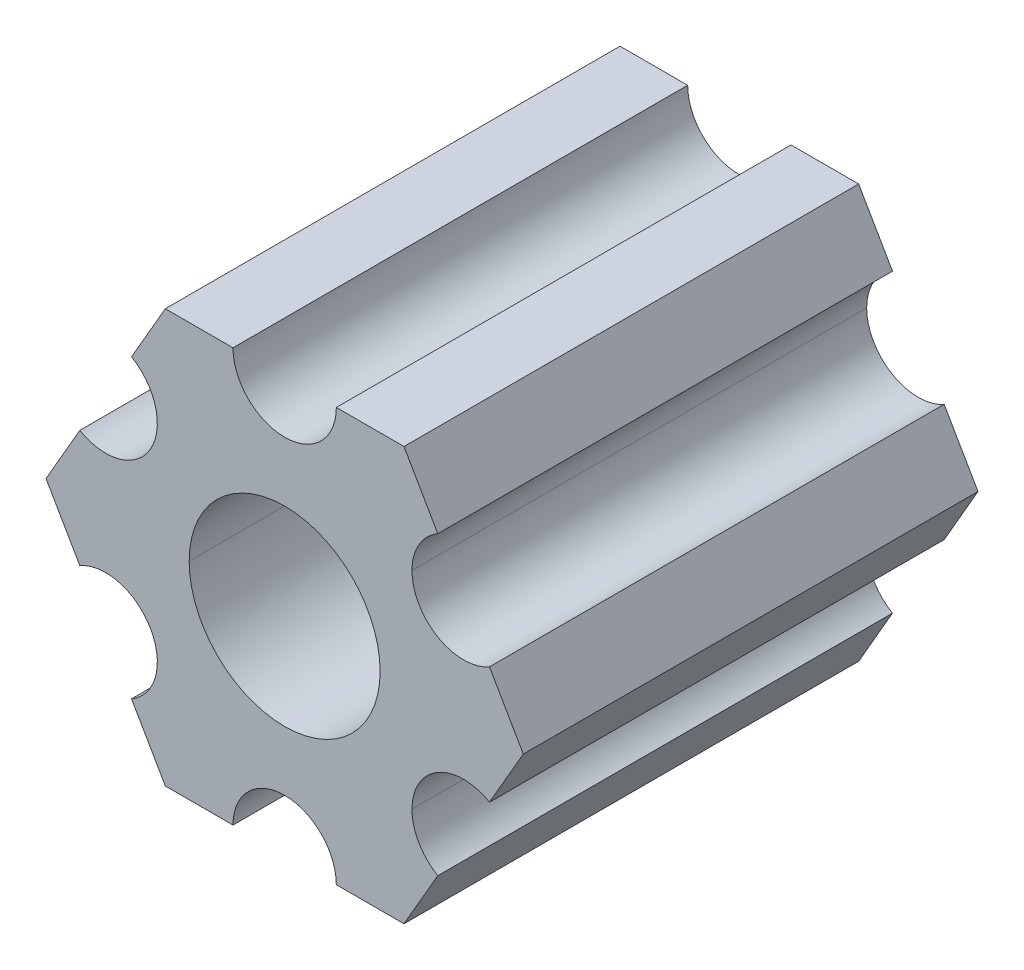
ISO-10303-21;
HEADER;
FILE_DESCRIPTION(('STEP AP214'),'2;1');
FILE_NAME('part.step','',(''),(''),'','','');
FILE_SCHEMA(('AUTOMOTIVE_DESIGN { 1 0 10303 214 1 1 1 1 }'));
ENDSEC;
DATA;
#1=APPLICATION_CONTEXT('core data for automotive mechanical design processes');
#2=APPLICATION_PROTOCOL_DEFINITION('international standard','automotive_design',2000,#1);
#3=PRODUCT_CONTEXT('',#1,'mechanical');
#4=PRODUCT('Part','Part','',(#3));
#5=PRODUCT_RELATED_PRODUCT_CATEGORY('part','',(#4));
#6=PRODUCT_DEFINITION_FORMATION('','',#4);
#7=PRODUCT_DEFINITION_CONTEXT('part definition',#1,'design');
#8=PRODUCT_DEFINITION('design','',#6,#7);
#9=PRODUCT_DEFINITION_SHAPE('','',#8);
#10=(LENGTH_UNIT() NAMED_UNIT(*) SI_UNIT(.MILLI.,.METRE.));
#11=(NAMED_UNIT(*) PLANE_ANGLE_UNIT() SI_UNIT($,.RADIAN.));
#12=(NAMED_UNIT(*) SI_UNIT($,.STERADIAN.) SOLID_ANGLE_UNIT());
#13=UNCERTAINTY_MEASURE_WITH_UNIT(LENGTH_MEASURE(1.E-05),#10,'distance_accuracy_value','');
#14=(GEOMETRIC_REPRESENTATION_CONTEXT(3) GLOBAL_UNCERTAINTY_ASSIGNED_CONTEXT((#13)) GLOBAL_UNIT_ASSIGNED_CONTEXT((#10,
#11,#12)) REPRESENTATION_CONTEXT('',''));
#15=CARTESIAN_POINT('',(0.,0.,0.));
#16=DIRECTION('',(0.,0.,1.));
#17=DIRECTION('',(1.,0.,0.));
#18=AXIS2_PLACEMENT_3D('',#15,#16,#17);
#19=CARTESIAN_POINT('',(0.,0.,304.8));
#20=DIRECTION('',(0.,0.,-1.));
#21=DIRECTION('',(-1.,0.,0.));
#22=AXIS2_PLACEMENT_3D('',#19,#20,#21);
#23=CYLINDRICAL_SURFACE('',#22,2.9337);
#24=DIRECTION('',(0.,0.,-1.));
#25=VECTOR('',#24,1.);
#26=CARTESIAN_POINT('',(2.9337,0.,304.8));
#27=LINE('',#26,#25);
#28=CARTESIAN_POINT('',(2.9337,0.,304.8));
#29=VERTEX_POINT('',#28);
#30=CARTESIAN_POINT('',(2.9337,0.,290.83));
#31=VERTEX_POINT('',#30);
#32=EDGE_CURVE('E220',#29,#31,#27,.T.);
#33=ORIENTED_EDGE('',*,*,#32,.T.);
#34=CARTESIAN_POINT('',(0.,0.,290.83));
#35=DIRECTION('',(0.,0.,1.));
#36=DIRECTION('',(1.,0.,0.));
#37=AXIS2_PLACEMENT_3D('',#34,#35,#36);
#38=CIRCLE('',#37,2.9337);
#39=CARTESIAN_POINT('',(-2.9337,0.,290.83));
#40=VERTEX_POINT('',#39);
#41=EDGE_CURVE('E67',#31,#40,#38,.F.);
#42=ORIENTED_EDGE('',*,*,#41,.T.);
#43=DIRECTION('',(0.,0.,-1.));
#44=VECTOR('',#43,1.);
#45=CARTESIAN_POINT('',(-2.9337,0.,304.8));
#46=LINE('',#45,#44);
#47=CARTESIAN_POINT('',(-2.9337,0.,304.8));
#48=VERTEX_POINT('',#47);
#49=EDGE_CURVE('E218',#48,#40,#46,.T.);
#50=ORIENTED_EDGE('',*,*,#49,.F.);
#51=CARTESIAN_POINT('',(0.,0.,304.8));
#52=DIRECTION('',(0.,0.,1.));
#53=DIRECTION('',(1.,0.,0.));
#54=AXIS2_PLACEMENT_3D('',#51,#52,#53);
#55=CIRCLE('',#54,2.9337);
#56=EDGE_CURVE('E53',#48,#29,#55,.T.);
#57=ORIENTED_EDGE('',*,*,#56,.T.);
#58=EDGE_LOOP('',(#33,#42,#50,#57));
#59=FACE_BOUND('',#58,.T.);
#60=ADVANCED_FACE('F46',(#59),#23,.F.);
#61=CARTESIAN_POINT('',(5.49926150638082,-3.17499966684067,304.8));
#62=DIRECTION('',(0.,0.,-1.));
#63=DIRECTION('',(-1.,0.,0.));
#64=AXIS2_PLACEMENT_3D('',#61,#62,#63);
#65=CYLINDRICAL_SURFACE('',#64,1.5875);
#66=DIRECTION('',(0.,0.,-1.));
#67=VECTOR('',#66,1.);
#68=CARTESIAN_POINT('',(3.91176150638082,-3.17499966684067,304.8));
#69=LINE('',#68,#67);
#70=CARTESIAN_POINT('',(3.91176150638082,-3.17499966684067,304.8));
#71=VERTEX_POINT('',#70);
#72=CARTESIAN_POINT('',(3.91176150638082,-3.17499966684067,290.83));
#73=VERTEX_POINT('',#72);
#74=EDGE_CURVE('E246',#71,#73,#69,.T.);
#75=ORIENTED_EDGE('',*,*,#74,.T.);
#76=CARTESIAN_POINT('',(5.49926150638082,-3.17499966684067,290.83));
#77=DIRECTION('',(0.,0.,1.));
#78=DIRECTION('',(1.,0.,0.));
#79=AXIS2_PLACEMENT_3D('',#76,#77,#78);
#80=CIRCLE('',#79,1.5875);
#81=CARTESIAN_POINT('',(6.29301142309098,-1.80018429024546,290.83));
#82=VERTEX_POINT('',#81);
#83=EDGE_CURVE('E60',#73,#82,#80,.F.);
#84=ORIENTED_EDGE('',*,*,#83,.T.);
#85=DIRECTION('',(0.,0.,-1.));
#86=VECTOR('',#85,1.);
#87=CARTESIAN_POINT('',(6.29301142309098,-1.80018429024546,304.8));
#88=LINE('',#87,#86);
#89=CARTESIAN_POINT('',(6.29301142309098,-1.80018429024546,304.8));
#90=VERTEX_POINT('',#89);
#91=EDGE_CURVE('E344',#90,#82,#88,.T.);
#92=ORIENTED_EDGE('',*,*,#91,.F.);
#93=CARTESIAN_POINT('',(5.49926150638082,-3.17499966684067,304.8));
#94=DIRECTION('',(0.,0.,-1.));
#95=DIRECTION('',(1.,0.,0.));
#96=AXIS2_PLACEMENT_3D('',#93,#94,#95);
#97=CIRCLE('',#96,1.5875);
#98=EDGE_CURVE('E297',#71,#90,#97,.T.);
#99=ORIENTED_EDGE('',*,*,#98,.F.);
#100=EDGE_LOOP('',(#75,#84,#92,#99));
#101=FACE_BOUND('',#100,.T.);
#102=ADVANCED_FACE('F481',(#101),#65,.F.);
#103=CARTESIAN_POINT('',(5.49926112168156,3.17500033315934,304.8));
#104=DIRECTION('',(0.,0.,-1.));
#105=DIRECTION('',(-1.,0.,0.));
#106=AXIS2_PLACEMENT_3D('',#103,#104,#105);
#107=CYLINDRICAL_SURFACE('',#106,1.5875);
#108=DIRECTION('',(0.,0.,-1.));
#109=VECTOR('',#108,1.);
#110=CARTESIAN_POINT('',(3.91176112168156,3.17500033315934,304.8));
#111=LINE('',#110,#109);
#112=CARTESIAN_POINT('',(3.91176112168156,3.17500033315934,304.8));
#113=VERTEX_POINT('',#112);
#114=CARTESIAN_POINT('',(3.91176112168156,3.17500033315934,290.83));
#115=VERTEX_POINT('',#114);
#116=EDGE_CURVE('E243',#113,#115,#111,.T.);
#117=ORIENTED_EDGE('',*,*,#116,.T.);
#118=CARTESIAN_POINT('',(5.49926112168156,3.17500033315934,290.83));
#119=DIRECTION('',(0.,0.,1.));
#120=DIRECTION('',(1.,0.,0.));
#121=AXIS2_PLACEMENT_3D('',#118,#119,#120);
#122=CIRCLE('',#121,1.5875);
#123=CARTESIAN_POINT('',(4.70551103839172,4.54981561357972,290.83));
#124=VERTEX_POINT('',#123);
#125=EDGE_CURVE('E425',#115,#124,#122,.F.);
#126=ORIENTED_EDGE('',*,*,#125,.T.);
#127=DIRECTION('',(0.,0.,-1.));
#128=VECTOR('',#127,1.);
#129=CARTESIAN_POINT('',(4.70551103839172,4.54981561357972,304.8));
#130=LINE('',#129,#128);
#131=CARTESIAN_POINT('',(4.70551103839172,4.54981561357972,304.8));
#132=VERTEX_POINT('',#131);
#133=EDGE_CURVE('E251',#132,#124,#130,.T.);
#134=ORIENTED_EDGE('',*,*,#133,.F.);
#135=CARTESIAN_POINT('',(5.49926112168156,3.17500033315934,304.8));
#136=DIRECTION('',(0.,0.,-1.));
#137=DIRECTION('',(1.,0.,0.));
#138=AXIS2_PLACEMENT_3D('',#135,#136,#137);
#139=CIRCLE('',#138,1.5875);
#140=EDGE_CURVE('E292',#113,#132,#139,.T.);
#141=ORIENTED_EDGE('',*,*,#140,.F.);
#142=EDGE_LOOP('',(#117,#126,#134,#141));
#143=FACE_BOUND('',#142,.T.);
#144=ADVANCED_FACE('F423',(#143),#107,.F.);
#145=CARTESIAN_POINT('',(5.49926112168156,3.17500033315934,304.8));
#146=DIRECTION('',(0.,0.,1.));
#147=DIRECTION('',(1.,0.,0.));
#148=AXIS2_PLACEMENT_3D('',#145,#146,#147);
#149=PLANE('',#148);
#150=DIRECTION('',(0.499999947533953,0.866025434075723,0.));
#151=VECTOR('',#150,1.);
#152=CARTESIAN_POINT('',(6.29301142309098,-1.80018429024546,304.8));
#153=LINE('',#152,#151);
#154=CARTESIAN_POINT('',(7.33234841870827,4.44212519169686E-07,304.8));
#155=VERTEX_POINT('',#154);
#156=EDGE_CURVE('E247',#90,#155,#153,.T.);
#157=ORIENTED_EDGE('',*,*,#156,.T.);
#158=DIRECTION('',(-0.500000052466056,0.866025373493145,0.));
#159=VECTOR('',#158,1.);
#160=CARTESIAN_POINT('',(7.33234841870827,4.44212519169686E-07,304.8));
#161=LINE('',#160,#159);
#162=CARTESIAN_POINT('',(6.29301120497139,1.80018505273894,304.8));
#163=VERTEX_POINT('',#162);
#164=EDGE_CURVE('E291',#155,#163,#161,.T.);
#165=ORIENTED_EDGE('',*,*,#164,.T.);
#166=CARTESIAN_POINT('',(5.49926112168156,3.17500033315934,304.8));
#167=DIRECTION('',(0.,0.,-1.));
#168=DIRECTION('',(1.,0.,0.));
#169=AXIS2_PLACEMENT_3D('',#166,#167,#168);
#170=CIRCLE('',#169,1.5875);
#171=EDGE_CURVE('E287',#163,#113,#170,.T.);
#172=ORIENTED_EDGE('',*,*,#171,.T.);
#173=ORIENTED_EDGE('',*,*,#140,.T.);
#174=DIRECTION('',(-0.500000052466046,0.866025373493151,0.));
#175=VECTOR('',#174,1.);
#176=CARTESIAN_POINT('',(4.70551103839172,4.54981561357972,304.8));
#177=LINE('',#176,#175);
#178=CARTESIAN_POINT('',(3.66617382465481,6.35000022210627,304.8));
#179=VERTEX_POINT('',#178);
#180=EDGE_CURVE('E307',#132,#179,#177,.T.);
#181=ORIENTED_EDGE('',*,*,#180,.T.);
#182=DIRECTION('',(-1.,-6.05825850611185E-08,0.));
#183=VECTOR('',#182,1.);
#184=CARTESIAN_POINT('',(3.66617382465481,6.35000022210627,304.8));
#185=LINE('',#184,#183);
#186=CARTESIAN_POINT('',(1.58749961530074,6.35000009617482,304.8));
#187=VERTEX_POINT('',#186);
#188=EDGE_CURVE('E303',#179,#187,#185,.T.);
#189=ORIENTED_EDGE('',*,*,#188,.T.);
#190=CARTESIAN_POINT('',(-3.84699260060323E-07,6.35,304.8));
#191=DIRECTION('',(0.,0.,-1.));
#192=DIRECTION('',(1.,0.,0.));
#193=AXIS2_PLACEMENT_3D('',#190,#191,#192);
#194=CIRCLE('',#193,1.5875);
#195=CARTESIAN_POINT('',(-1.58750038469926,6.34999990382519,304.8));
#196=VERTEX_POINT('',#195);
#197=EDGE_CURVE('E285',#187,#196,#194,.T.);
#198=ORIENTED_EDGE('',*,*,#197,.T.);
#199=DIRECTION('',(-1.,-6.05825963273174E-08,0.));
#200=VECTOR('',#199,1.);
#201=CARTESIAN_POINT('',(-1.58750038469926,6.34999990382518,304.8));
#202=LINE('',#201,#200);
#203=CARTESIAN_POINT('',(-3.66617459405349,6.3499997778937,304.8));
#204=VERTEX_POINT('',#203);
#205=EDGE_CURVE('E282',#196,#204,#202,.T.);
#206=ORIENTED_EDGE('',*,*,#205,.T.);
#207=DIRECTION('',(-0.499999947533943,-0.866025434075729,0.));
#208=VECTOR('',#207,1.);
#209=CARTESIAN_POINT('',(-3.66617459405349,6.3499997778937,304.8));
#210=LINE('',#209,#208);
#211=CARTESIAN_POINT('',(-4.70551158967065,4.54981504343587,304.8));
#212=VERTEX_POINT('',#211);
#213=EDGE_CURVE('E286',#204,#212,#210,.T.);
#214=ORIENTED_EDGE('',*,*,#213,.T.);
#215=CARTESIAN_POINT('',(-5.49926150638082,3.17499966684067,304.8));
#216=DIRECTION('',(0.,0.,-1.));
#217=DIRECTION('',(1.,0.,0.));
#218=AXIS2_PLACEMENT_3D('',#215,#216,#217);
#219=CIRCLE('',#218,1.5875);
#220=CARTESIAN_POINT('',(-6.29301142309098,1.80018429024547,304.8));
#221=VERTEX_POINT('',#220);
#222=EDGE_CURVE('E315',#212,#221,#219,.T.);
#223=ORIENTED_EDGE('',*,*,#222,.T.);
#224=DIRECTION('',(-0.499999947533951,-0.866025434075724,0.));
#225=VECTOR('',#224,1.);
#226=CARTESIAN_POINT('',(-6.29301142309098,1.80018429024547,304.8));
#227=LINE('',#226,#225);
#228=CARTESIAN_POINT('',(-7.33234841870827,-4.44212523790841E-07,304.8));
#229=VERTEX_POINT('',#228);
#230=EDGE_CURVE('E318',#221,#229,#227,.T.);
#231=ORIENTED_EDGE('',*,*,#230,.T.);
#232=DIRECTION('',(0.500000052466045,-0.866025373493151,0.));
#233=VECTOR('',#232,1.);
#234=CARTESIAN_POINT('',(-7.33234841870827,-4.44212523790841E-07,304.8));
#235=LINE('',#234,#233);
#236=CARTESIAN_POINT('',(-6.29301120497141,-1.80018505273897,304.8));
#237=VERTEX_POINT('',#236);
#238=EDGE_CURVE('E326',#229,#237,#235,.T.);
#239=ORIENTED_EDGE('',*,*,#238,.T.);
#240=CARTESIAN_POINT('',(-5.49926112168156,-3.17500033315934,304.8));
#241=DIRECTION('',(0.,0.,-1.));
#242=DIRECTION('',(1.,0.,0.));
#243=AXIS2_PLACEMENT_3D('',#240,#241,#242);
#244=CIRCLE('',#243,1.5875);
#245=CARTESIAN_POINT('',(-4.70551103839172,-4.54981561357972,304.8));
#246=VERTEX_POINT('',#245);
#247=EDGE_CURVE('E265',#237,#246,#244,.T.);
#248=ORIENTED_EDGE('',*,*,#247,.T.);
#249=DIRECTION('',(0.500000052466045,-0.866025373493152,0.));
#250=VECTOR('',#249,1.);
#251=CARTESIAN_POINT('',(-4.70551103839172,-4.54981561357972,304.8));
#252=LINE('',#251,#250);
#253=CARTESIAN_POINT('',(-3.66617382465481,-6.35000022210628,304.8));
#254=VERTEX_POINT('',#253);
#255=EDGE_CURVE('E256',#246,#254,#252,.T.);
#256=ORIENTED_EDGE('',*,*,#255,.T.);
#257=DIRECTION('',(1.,6.05825854783851E-08,0.));
#258=VECTOR('',#257,1.);
#259=CARTESIAN_POINT('',(-3.66617382465481,-6.35000022210628,304.8));
#260=LINE('',#259,#258);
#261=CARTESIAN_POINT('',(-1.58749961530073,-6.35000009617482,304.8));
#262=VERTEX_POINT('',#261);
#263=EDGE_CURVE('E253',#254,#262,#260,.T.);
#264=ORIENTED_EDGE('',*,*,#263,.T.);
#265=CARTESIAN_POINT('',(3.8469926204343E-07,-6.35,304.8));
#266=DIRECTION('',(0.,0.,-1.));
#267=DIRECTION('',(1.,0.,0.));
#268=AXIS2_PLACEMENT_3D('',#265,#266,#267);
#269=CIRCLE('',#268,1.5875);
#270=CARTESIAN_POINT('',(1.58750038469926,-6.34999990382518,304.8));
#271=VERTEX_POINT('',#270);
#272=EDGE_CURVE('E257',#262,#271,#269,.T.);
#273=ORIENTED_EDGE('',*,*,#272,.T.);
#274=DIRECTION('',(1.,6.05825721258438E-08,0.));
#275=VECTOR('',#274,1.);
#276=CARTESIAN_POINT('',(1.58750038469926,-6.34999990382518,304.8));
#277=LINE('',#276,#275);
#278=CARTESIAN_POINT('',(3.66617459405346,-6.34999977789375,304.8));
#279=VERTEX_POINT('',#278);
#280=EDGE_CURVE('E268',#271,#279,#277,.T.);
#281=ORIENTED_EDGE('',*,*,#280,.T.);
#282=DIRECTION('',(0.499999947533941,0.86602543407573,0.));
#283=VECTOR('',#282,1.);
#284=CARTESIAN_POINT('',(3.66617459405346,-6.34999977789375,304.8));
#285=LINE('',#284,#283);
#286=CARTESIAN_POINT('',(4.70551158967065,-4.54981504343587,304.8));
#287=VERTEX_POINT('',#286);
#288=EDGE_CURVE('E276',#279,#287,#285,.T.);
#289=ORIENTED_EDGE('',*,*,#288,.T.);
#290=CARTESIAN_POINT('',(5.49926150638082,-3.17499966684067,304.8));
#291=DIRECTION('',(0.,0.,-1.));
#292=DIRECTION('',(1.,0.,0.));
#293=AXIS2_PLACEMENT_3D('',#290,#291,#292);
#294=CIRCLE('',#293,1.5875);
#295=EDGE_CURVE('E293',#287,#71,#294,.T.);
#296=ORIENTED_EDGE('',*,*,#295,.T.);
#297=ORIENTED_EDGE('',*,*,#98,.T.);
#298=EDGE_LOOP('',(#157,#165,#172,#173,#181,#189,#198,#206,#214,#223,#231,#239,#248,#256,#264,
#273,#281,#289,#296,#297));
#299=FACE_BOUND('',#298,.T.);
#300=ORIENTED_EDGE('',*,*,#56,.F.);
#301=CARTESIAN_POINT('',(0.,0.,304.8));
#302=DIRECTION('',(0.,0.,1.));
#303=DIRECTION('',(1.,0.,0.));
#304=AXIS2_PLACEMENT_3D('',#301,#302,#303);
#305=CIRCLE('',#304,2.9337);
#306=EDGE_CURVE('E226',#29,#48,#305,.T.);
#307=ORIENTED_EDGE('',*,*,#306,.F.);
#308=EDGE_LOOP('',(#300,#307));
#309=FACE_BOUND('',#308,.T.);
#310=ADVANCED_FACE('F426',(#299,#309),#149,.T.);
#311=CARTESIAN_POINT('',(6.29301142309098,-1.80018429024546,304.8));
#312=DIRECTION('',(-0.866025434075723,0.499999947533953,0.));
#313=DIRECTION('',(0.,0.,1.));
#314=AXIS2_PLACEMENT_3D('',#311,#312,#313);
#315=PLANE('',#314);
#316=ORIENTED_EDGE('',*,*,#91,.T.);
#317=DIRECTION('',(0.499999947533953,0.866025434075723,0.));
#318=VECTOR('',#317,1.);
#319=CARTESIAN_POINT('',(6.29301142309098,-1.80018429024546,290.83));
#320=LINE('',#319,#318);
#321=CARTESIAN_POINT('',(7.33234841870827,4.44212519169686E-07,290.83));
#322=VERTEX_POINT('',#321);
#323=EDGE_CURVE('E228',#82,#322,#320,.T.);
#324=ORIENTED_EDGE('',*,*,#323,.T.);
#325=DIRECTION('',(0.,0.,-1.));
#326=VECTOR('',#325,1.);
#327=CARTESIAN_POINT('',(7.33234841870827,4.44212519169686E-07,304.8));
#328=LINE('',#327,#326);
#329=EDGE_CURVE('E340',#155,#322,#328,.T.);
#330=ORIENTED_EDGE('',*,*,#329,.F.);
#331=ORIENTED_EDGE('',*,*,#156,.F.);
#332=EDGE_LOOP('',(#316,#324,#330,#331));
#333=FACE_BOUND('',#332,.T.);
#334=ADVANCED_FACE('F485',(#333),#315,.F.);
#335=CARTESIAN_POINT('',(7.33234841870827,4.44212519169686E-07,304.8));
#336=DIRECTION('',(-0.866025373493145,-0.500000052466057,0.));
#337=DIRECTION('',(-0.500000052466057,0.866025373493145,0.));
#338=AXIS2_PLACEMENT_3D('',#335,#336,#337);
#339=PLANE('',#338);
#340=ORIENTED_EDGE('',*,*,#329,.T.);
#341=DIRECTION('',(-0.500000052466057,0.866025373493145,0.));
#342=VECTOR('',#341,1.);
#343=CARTESIAN_POINT('',(7.33234841870827,4.44212519169686E-07,290.83));
#344=LINE('',#343,#342);
#345=CARTESIAN_POINT('',(6.29301120497139,1.80018505273895,290.83));
#346=VERTEX_POINT('',#345);
#347=EDGE_CURVE('E237',#322,#346,#344,.T.);
#348=ORIENTED_EDGE('',*,*,#347,.T.);
#349=DIRECTION('',(0.,0.,-1.));
#350=VECTOR('',#349,1.);
#351=CARTESIAN_POINT('',(6.29301120497139,1.80018505273894,304.8));
#352=LINE('',#351,#350);
#353=EDGE_CURVE('E345',#163,#346,#352,.T.);
#354=ORIENTED_EDGE('',*,*,#353,.F.);
#355=ORIENTED_EDGE('',*,*,#164,.F.);
#356=EDGE_LOOP('',(#340,#348,#354,#355));
#357=FACE_BOUND('',#356,.T.);
#358=ADVANCED_FACE('F487',(#357),#339,.F.);
#359=CARTESIAN_POINT('',(5.49926112168156,3.17500033315934,304.8));
#360=DIRECTION('',(0.,0.,-1.));
#361=DIRECTION('',(-1.,0.,0.));
#362=AXIS2_PLACEMENT_3D('',#359,#360,#361);
#363=CYLINDRICAL_SURFACE('',#362,1.5875);
#364=ORIENTED_EDGE('',*,*,#353,.T.);
#365=CARTESIAN_POINT('',(5.49926112168156,3.17500033315934,290.83));
#366=DIRECTION('',(0.,0.,1.));
#367=DIRECTION('',(1.,0.,0.));
#368=AXIS2_PLACEMENT_3D('',#365,#366,#367);
#369=CIRCLE('',#368,1.5875);
#370=EDGE_CURVE('E433',#346,#115,#369,.F.);
#371=ORIENTED_EDGE('',*,*,#370,.T.);
#372=ORIENTED_EDGE('',*,*,#116,.F.);
#373=ORIENTED_EDGE('',*,*,#171,.F.);
#374=EDGE_LOOP('',(#364,#371,#372,#373));
#375=FACE_BOUND('',#374,.T.);
#376=ADVANCED_FACE('F490',(#375),#363,.F.);
#377=CARTESIAN_POINT('',(4.70551103839172,4.54981561357972,304.8));
#378=DIRECTION('',(-0.866025373493151,-0.500000052466046,0.));
#379=DIRECTION('',(-0.500000052466046,0.866025373493151,0.));
#380=AXIS2_PLACEMENT_3D('',#377,#378,#379);
#381=PLANE('',#380);
#382=ORIENTED_EDGE('',*,*,#133,.T.);
#383=DIRECTION('',(-0.500000052466046,0.866025373493151,0.));
#384=VECTOR('',#383,1.);
#385=CARTESIAN_POINT('',(4.70551103839172,4.54981561357972,290.83));
#386=LINE('',#385,#384);
#387=CARTESIAN_POINT('',(3.66617382465481,6.35000022210627,290.83));
#388=VERTEX_POINT('',#387);
#389=EDGE_CURVE('E419',#124,#388,#386,.T.);
#390=ORIENTED_EDGE('',*,*,#389,.T.);
#391=DIRECTION('',(0.,0.,-1.));
#392=VECTOR('',#391,1.);
#393=CARTESIAN_POINT('',(3.66617382465481,6.35000022210627,304.8));
#394=LINE('',#393,#392);
#395=EDGE_CURVE('E248',#179,#388,#394,.T.);
#396=ORIENTED_EDGE('',*,*,#395,.F.);
#397=ORIENTED_EDGE('',*,*,#180,.F.);
#398=EDGE_LOOP('',(#382,#390,#396,#397));
#399=FACE_BOUND('',#398,.T.);
#400=ADVANCED_FACE('F417',(#399),#381,.F.);
#401=CARTESIAN_POINT('',(3.66617382465481,6.35000022210627,304.8));
#402=DIRECTION('',(6.05825850611185E-08,-1.,0.));
#403=DIRECTION('',(0.,0.,-1.));
#404=AXIS2_PLACEMENT_3D('',#401,#402,#403);
#405=PLANE('',#404);
#406=ORIENTED_EDGE('',*,*,#395,.T.);
#407=DIRECTION('',(-0.999999999999998,-6.05825850611184E-08,0.));
#408=VECTOR('',#407,1.);
#409=CARTESIAN_POINT('',(3.66617382465481,6.35000022210627,290.83));
#410=LINE('',#409,#408);
#411=CARTESIAN_POINT('',(1.58749961530074,6.35,290.83));
#412=VERTEX_POINT('',#411);
#413=EDGE_CURVE('E439',#388,#412,#410,.T.);
#414=ORIENTED_EDGE('',*,*,#413,.T.);
#415=DIRECTION('',(0.,0.,-1.));
#416=VECTOR('',#415,1.);
#417=CARTESIAN_POINT('',(1.58749961530074,6.35000009617482,304.8));
#418=LINE('',#417,#416);
#419=EDGE_CURVE('E252',#187,#412,#418,.T.);
#420=ORIENTED_EDGE('',*,*,#419,.F.);
#421=ORIENTED_EDGE('',*,*,#188,.F.);
#422=EDGE_LOOP('',(#406,#414,#420,#421));
#423=FACE_BOUND('',#422,.T.);
#424=ADVANCED_FACE('F492',(#423),#405,.F.);
#425=CARTESIAN_POINT('',(-3.84699260060323E-07,6.35,304.8));
#426=DIRECTION('',(0.,0.,-1.));
#427=DIRECTION('',(-1.,0.,0.));
#428=AXIS2_PLACEMENT_3D('',#425,#426,#427);
#429=CYLINDRICAL_SURFACE('',#428,1.5875);
#430=ORIENTED_EDGE('',*,*,#419,.T.);
#431=CARTESIAN_POINT('',(-3.84699260060323E-07,6.35,290.83));
#432=DIRECTION('',(0.,0.,1.));
#433=DIRECTION('',(1.,0.,0.));
#434=AXIS2_PLACEMENT_3D('',#431,#432,#433);
#435=CIRCLE('',#434,1.5875);
#436=CARTESIAN_POINT('',(-1.58750038469926,6.34999990382518,290.83));
#437=VERTEX_POINT('',#436);
#438=EDGE_CURVE('E442',#412,#437,#435,.F.);
#439=ORIENTED_EDGE('',*,*,#438,.T.);
#440=DIRECTION('',(0.,0.,-1.));
#441=VECTOR('',#440,1.);
#442=CARTESIAN_POINT('',(-1.58750038469926,6.34999990382519,304.8));
#443=LINE('',#442,#441);
#444=EDGE_CURVE('E392',#196,#437,#443,.T.);
#445=ORIENTED_EDGE('',*,*,#444,.F.);
#446=ORIENTED_EDGE('',*,*,#197,.F.);
#447=EDGE_LOOP('',(#430,#439,#445,#446));
#448=FACE_BOUND('',#447,.T.);
#449=ADVANCED_FACE('F494',(#448),#429,.F.);
#450=CARTESIAN_POINT('',(-1.58750038469926,6.34999990382518,304.8));
#451=DIRECTION('',(6.05825963273174E-08,-1.,0.));
#452=DIRECTION('',(0.,0.,-1.));
#453=AXIS2_PLACEMENT_3D('',#450,#451,#452);
#454=PLANE('',#453);
#455=ORIENTED_EDGE('',*,*,#444,.T.);
#456=DIRECTION('',(-0.999999999999998,-6.05825963273173E-08,0.));
#457=VECTOR('',#456,1.);
#458=CARTESIAN_POINT('',(-1.58750038469926,6.34999990382518,290.83));
#459=LINE('',#458,#457);
#460=CARTESIAN_POINT('',(-3.66617459405349,6.3499997778937,290.83));
#461=VERTEX_POINT('',#460);
#462=EDGE_CURVE('E444',#437,#461,#459,.T.);
#463=ORIENTED_EDGE('',*,*,#462,.T.);
#464=DIRECTION('',(0.,0.,-1.));
#465=VECTOR('',#464,1.);
#466=CARTESIAN_POINT('',(-3.66617459405349,6.3499997778937,304.8));
#467=LINE('',#466,#465);
#468=EDGE_CURVE('E241',#204,#461,#467,.T.);
#469=ORIENTED_EDGE('',*,*,#468,.F.);
#470=ORIENTED_EDGE('',*,*,#205,.F.);
#471=EDGE_LOOP('',(#455,#463,#469,#470));
#472=FACE_BOUND('',#471,.T.);
#473=ADVANCED_FACE('F496',(#472),#454,.F.);
#474=CARTESIAN_POINT('',(-3.66617459405349,6.3499997778937,304.8));
#475=DIRECTION('',(0.866025434075729,-0.499999947533942,0.));
#476=DIRECTION('',(0.,0.,-1.));
#477=AXIS2_PLACEMENT_3D('',#474,#475,#476);
#478=PLANE('',#477);
#479=ORIENTED_EDGE('',*,*,#468,.T.);
#480=DIRECTION('',(-0.499999947533942,-0.866025434075729,0.));
#481=VECTOR('',#480,1.);
#482=CARTESIAN_POINT('',(-3.66617459405349,6.3499997778937,290.83));
#483=LINE('',#482,#481);
#484=CARTESIAN_POINT('',(-4.70551158967065,4.54981504343587,290.83));
#485=VERTEX_POINT('',#484);
#486=EDGE_CURVE('E446',#461,#485,#483,.T.);
#487=ORIENTED_EDGE('',*,*,#486,.T.);
#488=DIRECTION('',(0.,0.,-1.));
#489=VECTOR('',#488,1.);
#490=CARTESIAN_POINT('',(-4.70551158967065,4.54981504343587,304.8));
#491=LINE('',#490,#489);
#492=EDGE_CURVE('E357',#212,#485,#491,.T.);
#493=ORIENTED_EDGE('',*,*,#492,.F.);
#494=ORIENTED_EDGE('',*,*,#213,.F.);
#495=EDGE_LOOP('',(#479,#487,#493,#494));
#496=FACE_BOUND('',#495,.T.);
#497=ADVANCED_FACE('F502',(#496),#478,.F.);
#498=CARTESIAN_POINT('',(-5.49926150638082,3.17499966684067,304.8));
#499=DIRECTION('',(0.,0.,-1.));
#500=DIRECTION('',(-1.,0.,0.));
#501=AXIS2_PLACEMENT_3D('',#498,#499,#500);
#502=CYLINDRICAL_SURFACE('',#501,1.5875);
#503=ORIENTED_EDGE('',*,*,#492,.T.);
#504=CARTESIAN_POINT('',(-5.49926150638082,3.17499966684067,290.83));
#505=DIRECTION('',(0.,0.,1.));
#506=DIRECTION('',(1.,0.,0.));
#507=AXIS2_PLACEMENT_3D('',#504,#505,#506);
#508=CIRCLE('',#507,1.5875);
#509=CARTESIAN_POINT('',(-6.29301142309098,1.80018429024547,290.83));
#510=VERTEX_POINT('',#509);
#511=EDGE_CURVE('E449',#485,#510,#508,.F.);
#512=ORIENTED_EDGE('',*,*,#511,.T.);
#513=DIRECTION('',(0.,0.,-1.));
#514=VECTOR('',#513,1.);
#515=CARTESIAN_POINT('',(-6.29301142309098,1.80018429024547,304.8));
#516=LINE('',#515,#514);
#517=EDGE_CURVE('E360',#221,#510,#516,.T.);
#518=ORIENTED_EDGE('',*,*,#517,.F.);
#519=ORIENTED_EDGE('',*,*,#222,.F.);
#520=EDGE_LOOP('',(#503,#512,#518,#519));
#521=FACE_BOUND('',#520,.T.);
#522=ADVANCED_FACE('F535',(#521),#502,.F.);
#523=CARTESIAN_POINT('',(-6.29301142309098,1.80018429024547,304.8));
#524=DIRECTION('',(0.866025434075724,-0.499999947533952,0.));
#525=DIRECTION('',(0.,0.,-1.));
#526=AXIS2_PLACEMENT_3D('',#523,#524,#525);
#527=PLANE('',#526);
#528=ORIENTED_EDGE('',*,*,#517,.T.);
#529=DIRECTION('',(-0.499999947533952,-0.866025434075724,0.));
#530=VECTOR('',#529,1.);
#531=CARTESIAN_POINT('',(-6.29301142309098,1.80018429024547,290.83));
#532=LINE('',#531,#530);
#533=CARTESIAN_POINT('',(-7.33234841870827,-4.44212523790841E-07,290.83));
#534=VERTEX_POINT('',#533);
#535=EDGE_CURVE('E452',#510,#534,#532,.T.);
#536=ORIENTED_EDGE('',*,*,#535,.T.);
#537=DIRECTION('',(0.,0.,-1.));
#538=VECTOR('',#537,1.);
#539=CARTESIAN_POINT('',(-7.33234841870827,-4.44212523790841E-07,304.8));
#540=LINE('',#539,#538);
#541=EDGE_CURVE('E280',#229,#534,#540,.T.);
#542=ORIENTED_EDGE('',*,*,#541,.F.);
#543=ORIENTED_EDGE('',*,*,#230,.F.);
#544=EDGE_LOOP('',(#528,#536,#542,#543));
#545=FACE_BOUND('',#544,.T.);
#546=ADVANCED_FACE('F539',(#545),#527,.F.);
#547=CARTESIAN_POINT('',(-7.33234841870827,-4.44212523790841E-07,304.8));
#548=DIRECTION('',(0.866025373493151,0.500000052466045,0.));
#549=DIRECTION('',(0.,0.,-1.));
#550=AXIS2_PLACEMENT_3D('',#547,#548,#549);
#551=PLANE('',#550);
#552=ORIENTED_EDGE('',*,*,#541,.T.);
#553=DIRECTION('',(0.500000052466045,-0.866025373493151,0.));
#554=VECTOR('',#553,1.);
#555=CARTESIAN_POINT('',(-7.33234841870827,-4.44212523790841E-07,290.83));
#556=LINE('',#555,#554);
#557=CARTESIAN_POINT('',(-6.29301120497141,-1.80018505273896,290.83));
#558=VERTEX_POINT('',#557);
#559=EDGE_CURVE('E455',#534,#558,#556,.T.);
#560=ORIENTED_EDGE('',*,*,#559,.T.);
#561=DIRECTION('',(0.,0.,-1.));
#562=VECTOR('',#561,1.);
#563=CARTESIAN_POINT('',(-6.29301120497141,-1.80018505273897,304.8));
#564=LINE('',#563,#562);
#565=EDGE_CURVE('E298',#237,#558,#564,.T.);
#566=ORIENTED_EDGE('',*,*,#565,.F.);
#567=ORIENTED_EDGE('',*,*,#238,.F.);
#568=EDGE_LOOP('',(#552,#560,#566,#567));
#569=FACE_BOUND('',#568,.T.);
#570=ADVANCED_FACE('F545',(#569),#551,.F.);
#571=CARTESIAN_POINT('',(-5.49926112168156,-3.17500033315934,304.8));
#572=DIRECTION('',(0.,0.,-1.));
#573=DIRECTION('',(-1.,0.,0.));
#574=AXIS2_PLACEMENT_3D('',#571,#572,#573);
#575=CYLINDRICAL_SURFACE('',#574,1.5875);
#576=ORIENTED_EDGE('',*,*,#565,.T.);
#577=CARTESIAN_POINT('',(-5.49926112168156,-3.17500033315934,290.83));
#578=DIRECTION('',(0.,0.,1.));
#579=DIRECTION('',(1.,0.,0.));
#580=AXIS2_PLACEMENT_3D('',#577,#578,#579);
#581=CIRCLE('',#580,1.5875);
#582=CARTESIAN_POINT('',(-4.70551103839172,-4.54981561357972,290.83));
#583=VERTEX_POINT('',#582);
#584=EDGE_CURVE('E458',#558,#583,#581,.F.);
#585=ORIENTED_EDGE('',*,*,#584,.T.);
#586=DIRECTION('',(0.,0.,-1.));
#587=VECTOR('',#586,1.);
#588=CARTESIAN_POINT('',(-4.70551103839172,-4.54981561357972,304.8));
#589=LINE('',#588,#587);
#590=EDGE_CURVE('E302',#246,#583,#589,.T.);
#591=ORIENTED_EDGE('',*,*,#590,.F.);
#592=ORIENTED_EDGE('',*,*,#247,.F.);
#593=EDGE_LOOP('',(#576,#585,#591,#592));
#594=FACE_BOUND('',#593,.T.);
#595=ADVANCED_FACE('F549',(#594),#575,.F.);
#596=CARTESIAN_POINT('',(-4.70551103839172,-4.54981561357972,304.8));
#597=DIRECTION('',(0.866025373493152,0.500000052466045,0.));
#598=DIRECTION('',(0.,0.,-1.));
#599=AXIS2_PLACEMENT_3D('',#596,#597,#598);
#600=PLANE('',#599);
#601=ORIENTED_EDGE('',*,*,#590,.T.);
#602=DIRECTION('',(0.500000052466045,-0.866025373493152,0.));
#603=VECTOR('',#602,1.);
#604=CARTESIAN_POINT('',(-4.70551103839172,-4.54981561357972,290.83));
#605=LINE('',#604,#603);
#606=CARTESIAN_POINT('',(-3.66617382465481,-6.35000022210628,290.83));
#607=VERTEX_POINT('',#606);
#608=EDGE_CURVE('E461',#583,#607,#605,.T.);
#609=ORIENTED_EDGE('',*,*,#608,.T.);
#610=DIRECTION('',(0.,0.,-1.));
#611=VECTOR('',#610,1.);
#612=CARTESIAN_POINT('',(-3.66617382465481,-6.35000022210628,304.8));
#613=LINE('',#612,#611);
#614=EDGE_CURVE('E353',#254,#607,#613,.T.);
#615=ORIENTED_EDGE('',*,*,#614,.F.);
#616=ORIENTED_EDGE('',*,*,#255,.F.);
#617=EDGE_LOOP('',(#601,#609,#615,#616));
#618=FACE_BOUND('',#617,.T.);
#619=ADVANCED_FACE('F557',(#618),#600,.F.);
#620=CARTESIAN_POINT('',(-3.66617382465481,-6.35000022210628,304.8));
#621=DIRECTION('',(-6.05825854783851E-08,1.,0.));
#622=DIRECTION('',(0.,0.,1.));
#623=AXIS2_PLACEMENT_3D('',#620,#621,#622);
#624=PLANE('',#623);
#625=ORIENTED_EDGE('',*,*,#614,.T.);
#626=DIRECTION('',(0.999999999999998,6.0582585478385E-08,0.));
#627=VECTOR('',#626,1.);
#628=CARTESIAN_POINT('',(-3.66617382465481,-6.35000022210628,290.83));
#629=LINE('',#628,#627);
#630=CARTESIAN_POINT('',(-1.58749961530073,-6.35000009617482,290.83));
#631=VERTEX_POINT('',#630);
#632=EDGE_CURVE('E464',#607,#631,#629,.T.);
#633=ORIENTED_EDGE('',*,*,#632,.T.);
#634=DIRECTION('',(0.,0.,-1.));
#635=VECTOR('',#634,1.);
#636=CARTESIAN_POINT('',(-1.58749961530073,-6.35000009617482,304.8));
#637=LINE('',#636,#635);
#638=EDGE_CURVE('E349',#262,#631,#637,.T.);
#639=ORIENTED_EDGE('',*,*,#638,.F.);
#640=ORIENTED_EDGE('',*,*,#263,.F.);
#641=EDGE_LOOP('',(#625,#633,#639,#640));
#642=FACE_BOUND('',#641,.T.);
#643=ADVANCED_FACE('F519',(#642),#624,.F.);
#644=CARTESIAN_POINT('',(3.8469926204343E-07,-6.35,304.8));
#645=DIRECTION('',(0.,0.,-1.));
#646=DIRECTION('',(-1.,0.,0.));
#647=AXIS2_PLACEMENT_3D('',#644,#645,#646);
#648=CYLINDRICAL_SURFACE('',#647,1.5875);
#649=ORIENTED_EDGE('',*,*,#638,.T.);
#650=CARTESIAN_POINT('',(3.8469926204343E-07,-6.35,290.83));
#651=DIRECTION('',(0.,0.,1.));
#652=DIRECTION('',(1.,0.,0.));
#653=AXIS2_PLACEMENT_3D('',#650,#651,#652);
#654=CIRCLE('',#653,1.5875);
#655=CARTESIAN_POINT('',(1.58750038469926,-6.34999990382518,290.83));
#656=VERTEX_POINT('',#655);
#657=EDGE_CURVE('E467',#631,#656,#654,.F.);
#658=ORIENTED_EDGE('',*,*,#657,.T.);
#659=DIRECTION('',(0.,0.,-1.));
#660=VECTOR('',#659,1.);
#661=CARTESIAN_POINT('',(1.58750038469926,-6.34999990382518,304.8));
#662=LINE('',#661,#660);
#663=EDGE_CURVE('E314',#271,#656,#662,.T.);
#664=ORIENTED_EDGE('',*,*,#663,.F.);
#665=ORIENTED_EDGE('',*,*,#272,.F.);
#666=EDGE_LOOP('',(#649,#658,#664,#665));
#667=FACE_BOUND('',#666,.T.);
#668=ADVANCED_FACE('F516',(#667),#648,.F.);
#669=CARTESIAN_POINT('',(1.58750038469926,-6.34999990382518,304.8));
#670=DIRECTION('',(-6.05825721258438E-08,1.,0.));
#671=DIRECTION('',(0.,0.,1.));
#672=AXIS2_PLACEMENT_3D('',#669,#670,#671);
#673=PLANE('',#672);
#674=ORIENTED_EDGE('',*,*,#663,.T.);
#675=DIRECTION('',(0.999999999999998,6.05825721258437E-08,0.));
#676=VECTOR('',#675,1.);
#677=CARTESIAN_POINT('',(1.58750038469926,-6.34999990382518,290.83));
#678=LINE('',#677,#676);
#679=CARTESIAN_POINT('',(3.66617459405346,-6.34999977789375,290.83));
#680=VERTEX_POINT('',#679);
#681=EDGE_CURVE('E470',#656,#680,#678,.T.);
#682=ORIENTED_EDGE('',*,*,#681,.T.);
#683=DIRECTION('',(0.,0.,-1.));
#684=VECTOR('',#683,1.);
#685=CARTESIAN_POINT('',(3.66617459405346,-6.34999977789375,304.8));
#686=LINE('',#685,#684);
#687=EDGE_CURVE('E311',#279,#680,#686,.T.);
#688=ORIENTED_EDGE('',*,*,#687,.F.);
#689=ORIENTED_EDGE('',*,*,#280,.F.);
#690=EDGE_LOOP('',(#674,#682,#688,#689));
#691=FACE_BOUND('',#690,.T.);
#692=ADVANCED_FACE('F518',(#691),#673,.F.);
#693=CARTESIAN_POINT('',(3.66617459405346,-6.34999977789375,304.8));
#694=DIRECTION('',(-0.86602543407573,0.499999947533941,0.));
#695=DIRECTION('',(0.,0.,1.));
#696=AXIS2_PLACEMENT_3D('',#693,#694,#695);
#697=PLANE('',#696);
#698=ORIENTED_EDGE('',*,*,#687,.T.);
#699=DIRECTION('',(0.499999947533941,0.86602543407573,0.));
#700=VECTOR('',#699,1.);
#701=CARTESIAN_POINT('',(3.66617459405346,-6.34999977789375,290.83));
#702=LINE('',#701,#700);
#703=CARTESIAN_POINT('',(4.70551158967065,-4.54981504343587,290.83));
#704=VERTEX_POINT('',#703);
#705=EDGE_CURVE('E473',#680,#704,#702,.T.);
#706=ORIENTED_EDGE('',*,*,#705,.T.);
#707=DIRECTION('',(0.,0.,-1.));
#708=VECTOR('',#707,1.);
#709=CARTESIAN_POINT('',(4.70551158967065,-4.54981504343587,304.8));
#710=LINE('',#709,#708);
#711=EDGE_CURVE('E234',#287,#704,#710,.T.);
#712=ORIENTED_EDGE('',*,*,#711,.F.);
#713=ORIENTED_EDGE('',*,*,#288,.F.);
#714=EDGE_LOOP('',(#698,#706,#712,#713));
#715=FACE_BOUND('',#714,.T.);
#716=ADVANCED_FACE('F553',(#715),#697,.F.);
#717=CARTESIAN_POINT('',(5.49926150638082,-3.17499966684067,304.8));
#718=DIRECTION('',(0.,0.,-1.));
#719=DIRECTION('',(-1.,0.,0.));
#720=AXIS2_PLACEMENT_3D('',#717,#718,#719);
#721=CYLINDRICAL_SURFACE('',#720,1.5875);
#722=ORIENTED_EDGE('',*,*,#711,.T.);
#723=CARTESIAN_POINT('',(5.49926150638082,-3.17499966684067,290.83));
#724=DIRECTION('',(0.,0.,1.));
#725=DIRECTION('',(1.,0.,0.));
#726=AXIS2_PLACEMENT_3D('',#723,#724,#725);
#727=CIRCLE('',#726,1.5875);
#728=EDGE_CURVE('E221',#704,#73,#727,.F.);
#729=ORIENTED_EDGE('',*,*,#728,.T.);
#730=ORIENTED_EDGE('',*,*,#74,.F.);
#731=ORIENTED_EDGE('',*,*,#295,.F.);
#732=EDGE_LOOP('',(#722,#729,#730,#731));
#733=FACE_BOUND('',#732,.T.);
#734=ADVANCED_FACE('F478',(#733),#721,.F.);
#735=CARTESIAN_POINT('',(0.,0.,304.8));
#736=DIRECTION('',(0.,0.,-1.));
#737=DIRECTION('',(-1.,0.,0.));
#738=AXIS2_PLACEMENT_3D('',#735,#736,#737);
#739=CYLINDRICAL_SURFACE('',#738,2.9337);
#740=ORIENTED_EDGE('',*,*,#49,.T.);
#741=CARTESIAN_POINT('',(0.,0.,290.83));
#742=DIRECTION('',(0.,0.,1.));
#743=DIRECTION('',(1.,0.,0.));
#744=AXIS2_PLACEMENT_3D('',#741,#742,#743);
#745=CIRCLE('',#744,2.9337);
#746=EDGE_CURVE('E12',#40,#31,#745,.F.);
#747=ORIENTED_EDGE('',*,*,#746,.T.);
#748=ORIENTED_EDGE('',*,*,#32,.F.);
#749=ORIENTED_EDGE('',*,*,#306,.T.);
#750=EDGE_LOOP('',(#740,#747,#748,#749));
#751=FACE_BOUND('',#750,.T.);
#752=ADVANCED_FACE('F224',(#751),#739,.F.);
#753=CARTESIAN_POINT('',(5.49926112168156,3.17500033315934,290.83));
#754=DIRECTION('',(0.,0.,1.));
#755=DIRECTION('',(1.,0.,0.));
#756=AXIS2_PLACEMENT_3D('',#753,#754,#755);
#757=PLANE('',#756);
#758=ORIENTED_EDGE('',*,*,#746,.F.);
#759=ORIENTED_EDGE('',*,*,#41,.F.);
#760=EDGE_LOOP('',(#758,#759));
#761=FACE_BOUND('',#760,.T.);
#762=ORIENTED_EDGE('',*,*,#83,.F.);
#763=ORIENTED_EDGE('',*,*,#728,.F.);
#764=ORIENTED_EDGE('',*,*,#705,.F.);
#765=ORIENTED_EDGE('',*,*,#681,.F.);
#766=ORIENTED_EDGE('',*,*,#657,.F.);
#767=ORIENTED_EDGE('',*,*,#632,.F.);
#768=ORIENTED_EDGE('',*,*,#608,.F.);
#769=ORIENTED_EDGE('',*,*,#584,.F.);
#770=ORIENTED_EDGE('',*,*,#559,.F.);
#771=ORIENTED_EDGE('',*,*,#535,.F.);
#772=ORIENTED_EDGE('',*,*,#511,.F.);
#773=ORIENTED_EDGE('',*,*,#486,.F.);
#774=ORIENTED_EDGE('',*,*,#462,.F.);
#775=ORIENTED_EDGE('',*,*,#438,.F.);
#776=ORIENTED_EDGE('',*,*,#413,.F.);
#777=ORIENTED_EDGE('',*,*,#389,.F.);
#778=ORIENTED_EDGE('',*,*,#125,.F.);
#779=ORIENTED_EDGE('',*,*,#370,.F.);
#780=ORIENTED_EDGE('',*,*,#347,.F.);
#781=ORIENTED_EDGE('',*,*,#323,.F.);
#782=EDGE_LOOP('',(#762,#763,#764,#765,#766,#767,#768,#769,#770,#771,#772,#773,#774,#775,#776,
#777,#778,#779,#780,#781));
#783=FACE_BOUND('',#782,.T.);
#784=ADVANCED_FACE('F212',(#761,#783),#757,.F.);
#785=CLOSED_SHELL('',(#60,#102,#144,#310,#334,#358,#376,#400,#424,#449,#473,#497,#522,#546,#570,
#595,#619,#643,#668,#692,#716,#734,#752,#784));
#786=MANIFOLD_SOLID_BREP('B2',#785);
#787=ADVANCED_BREP_SHAPE_REPRESENTATION('',(#18,#786),#14);
#788=SHAPE_DEFINITION_REPRESENTATION(#9,#787);
ENDSEC;
END-ISO-10303-21;
